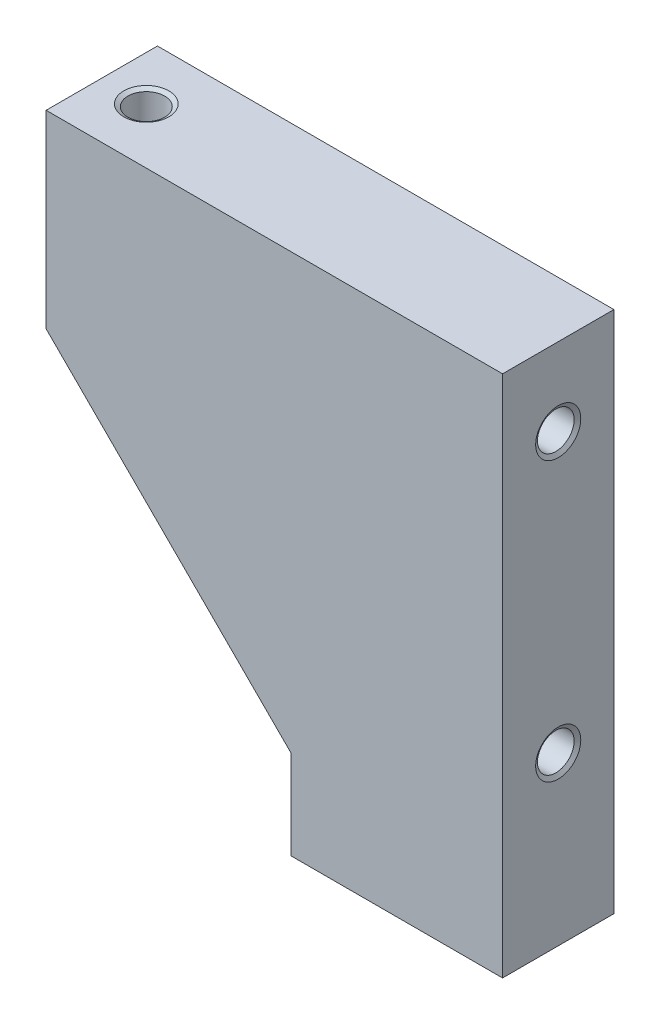
ISO-10303-21;
HEADER;
FILE_DESCRIPTION(('STEP AP214'),'2;1');
FILE_NAME('part.step','',(''),(''),'','','');
FILE_SCHEMA(('AUTOMOTIVE_DESIGN { 1 0 10303 214 1 1 1 1 }'));
ENDSEC;
DATA;
#1=APPLICATION_CONTEXT('core data for automotive mechanical design processes');
#2=APPLICATION_PROTOCOL_DEFINITION('international standard','automotive_design',2000,#1);
#3=PRODUCT_CONTEXT('',#1,'mechanical');
#4=PRODUCT('Part','Part','',(#3));
#5=PRODUCT_RELATED_PRODUCT_CATEGORY('part','',(#4));
#6=PRODUCT_DEFINITION_FORMATION('','',#4);
#7=PRODUCT_DEFINITION_CONTEXT('part definition',#1,'design');
#8=PRODUCT_DEFINITION('design','',#6,#7);
#9=PRODUCT_DEFINITION_SHAPE('','',#8);
#10=(LENGTH_UNIT() NAMED_UNIT(*) SI_UNIT(.MILLI.,.METRE.));
#11=(NAMED_UNIT(*) PLANE_ANGLE_UNIT() SI_UNIT($,.RADIAN.));
#12=(NAMED_UNIT(*) SI_UNIT($,.STERADIAN.) SOLID_ANGLE_UNIT());
#13=UNCERTAINTY_MEASURE_WITH_UNIT(LENGTH_MEASURE(1.E-05),#10,'distance_accuracy_value','');
#14=(GEOMETRIC_REPRESENTATION_CONTEXT(3) GLOBAL_UNCERTAINTY_ASSIGNED_CONTEXT((#13)) GLOBAL_UNIT_ASSIGNED_CONTEXT((#10,
#11,#12)) REPRESENTATION_CONTEXT('',''));
#15=CARTESIAN_POINT('',(0.,0.,0.));
#16=DIRECTION('',(0.,0.,1.));
#17=DIRECTION('',(1.,0.,0.));
#18=AXIS2_PLACEMENT_3D('',#15,#16,#17);
#19=CARTESIAN_POINT('',(19.,0.,10.));
#20=DIRECTION('',(0.,1.,0.));
#21=DIRECTION('',(-1.,0.,0.));
#22=AXIS2_PLACEMENT_3D('',#19,#20,#21);
#23=PLANE('',#22);
#24=DIRECTION('',(1.,0.,0.));
#25=VECTOR('',#24,1.);
#26=CARTESIAN_POINT('',(19.,0.,0.));
#27=LINE('',#26,#25);
#28=CARTESIAN_POINT('',(0.,0.,0.));
#29=VERTEX_POINT('',#28);
#30=CARTESIAN_POINT('',(19.,0.,0.));
#31=VERTEX_POINT('',#30);
#32=EDGE_CURVE('E125',#29,#31,#27,.T.);
#33=ORIENTED_EDGE('',*,*,#32,.T.);
#34=DIRECTION('',(0.,0.,-1.));
#35=VECTOR('',#34,1.);
#36=CARTESIAN_POINT('',(19.,0.,10.));
#37=LINE('',#36,#35);
#38=CARTESIAN_POINT('',(19.,0.,10.));
#39=VERTEX_POINT('',#38);
#40=EDGE_CURVE('E11',#39,#31,#37,.T.);
#41=ORIENTED_EDGE('',*,*,#40,.F.);
#42=DIRECTION('',(1.,0.,0.));
#43=VECTOR('',#42,1.);
#44=CARTESIAN_POINT('',(19.,0.,10.));
#45=LINE('',#44,#43);
#46=CARTESIAN_POINT('',(0.,0.,10.));
#47=VERTEX_POINT('',#46);
#48=EDGE_CURVE('E136',#47,#39,#45,.T.);
#49=ORIENTED_EDGE('',*,*,#48,.F.);
#50=DIRECTION('',(0.,0.,-1.));
#51=VECTOR('',#50,1.);
#52=CARTESIAN_POINT('',(0.,0.,10.));
#53=LINE('',#52,#51);
#54=EDGE_CURVE('E121',#47,#29,#53,.T.);
#55=ORIENTED_EDGE('',*,*,#54,.T.);
#56=EDGE_LOOP('',(#33,#41,#49,#55));
#57=FACE_BOUND('',#56,.T.);
#58=ADVANCED_FACE('F38',(#57),#23,.F.);
#59=CARTESIAN_POINT('',(19.,47.,10.));
#60=DIRECTION('',(-1.,0.,0.));
#61=DIRECTION('',(0.,-1.,0.));
#62=AXIS2_PLACEMENT_3D('',#59,#60,#61);
#63=PLANE('',#62);
#64=CARTESIAN_POINT('',(19.,40.,5.));
#65=DIRECTION('',(1.,0.,0.));
#66=DIRECTION('',(0.,0.,-1.));
#67=AXIS2_PLACEMENT_3D('',#64,#65,#66);
#68=CIRCLE('',#67,2.025);
#69=CARTESIAN_POINT('',(19.,40.,2.975));
#70=VERTEX_POINT('',#69);
#71=EDGE_CURVE('E194',#70,#70,#68,.T.);
#72=ORIENTED_EDGE('',*,*,#71,.F.);
#73=EDGE_LOOP('',(#72));
#74=FACE_BOUND('',#73,.T.);
#75=CARTESIAN_POINT('',(19.,15.,5.));
#76=DIRECTION('',(1.,0.,0.));
#77=DIRECTION('',(0.,0.,-1.));
#78=AXIS2_PLACEMENT_3D('',#75,#76,#77);
#79=CIRCLE('',#78,2.025);
#80=CARTESIAN_POINT('',(19.,15.,2.975));
#81=VERTEX_POINT('',#80);
#82=EDGE_CURVE('E203',#81,#81,#79,.T.);
#83=ORIENTED_EDGE('',*,*,#82,.F.);
#84=EDGE_LOOP('',(#83));
#85=FACE_BOUND('',#84,.T.);
#86=DIRECTION('',(0.,1.,0.));
#87=VECTOR('',#86,1.);
#88=CARTESIAN_POINT('',(19.,47.,0.));
#89=LINE('',#88,#87);
#90=CARTESIAN_POINT('',(19.,47.,0.));
#91=VERTEX_POINT('',#90);
#92=EDGE_CURVE('E128',#31,#91,#89,.T.);
#93=ORIENTED_EDGE('',*,*,#92,.T.);
#94=DIRECTION('',(0.,0.,-1.));
#95=VECTOR('',#94,1.);
#96=CARTESIAN_POINT('',(19.,47.,10.));
#97=LINE('',#96,#95);
#98=CARTESIAN_POINT('',(19.,47.,10.));
#99=VERTEX_POINT('',#98);
#100=EDGE_CURVE('E46',#99,#91,#97,.T.);
#101=ORIENTED_EDGE('',*,*,#100,.F.);
#102=DIRECTION('',(0.,1.,0.));
#103=VECTOR('',#102,1.);
#104=CARTESIAN_POINT('',(19.,47.,10.));
#105=LINE('',#104,#103);
#106=EDGE_CURVE('E92',#39,#99,#105,.T.);
#107=ORIENTED_EDGE('',*,*,#106,.F.);
#108=ORIENTED_EDGE('',*,*,#40,.T.);
#109=EDGE_LOOP('',(#93,#101,#107,#108));
#110=FACE_BOUND('',#109,.T.);
#111=ADVANCED_FACE('F160',(#74,#85,#110),#63,.F.);
#112=CARTESIAN_POINT('',(-22.,47.,10.));
#113=DIRECTION('',(0.,-1.,0.));
#114=DIRECTION('',(0.,0.,-1.));
#115=AXIS2_PLACEMENT_3D('',#112,#113,#114);
#116=PLANE('',#115);
#117=CARTESIAN_POINT('',(-18.,47.,5.));
#118=DIRECTION('',(0.,1.,0.));
#119=DIRECTION('',(0.,0.,1.));
#120=AXIS2_PLACEMENT_3D('',#117,#118,#119);
#121=CIRCLE('',#120,2.025);
#122=CARTESIAN_POINT('',(-18.,47.,7.025));
#123=VERTEX_POINT('',#122);
#124=EDGE_CURVE('E415',#123,#123,#121,.T.);
#125=ORIENTED_EDGE('',*,*,#124,.F.);
#126=EDGE_LOOP('',(#125));
#127=FACE_BOUND('',#126,.T.);
#128=DIRECTION('',(-1.,0.,0.));
#129=VECTOR('',#128,1.);
#130=CARTESIAN_POINT('',(-22.,47.,0.));
#131=LINE('',#130,#129);
#132=CARTESIAN_POINT('',(-22.,47.,0.));
#133=VERTEX_POINT('',#132);
#134=EDGE_CURVE('E131',#91,#133,#131,.T.);
#135=ORIENTED_EDGE('',*,*,#134,.T.);
#136=DIRECTION('',(0.,0.,-1.));
#137=VECTOR('',#136,1.);
#138=CARTESIAN_POINT('',(-22.,47.,10.));
#139=LINE('',#138,#137);
#140=CARTESIAN_POINT('',(-22.,47.,10.));
#141=VERTEX_POINT('',#140);
#142=EDGE_CURVE('E116',#141,#133,#139,.T.);
#143=ORIENTED_EDGE('',*,*,#142,.F.);
#144=DIRECTION('',(-1.,0.,0.));
#145=VECTOR('',#144,1.);
#146=CARTESIAN_POINT('',(-22.,47.,10.));
#147=LINE('',#146,#145);
#148=EDGE_CURVE('E107',#99,#141,#147,.T.);
#149=ORIENTED_EDGE('',*,*,#148,.F.);
#150=ORIENTED_EDGE('',*,*,#100,.T.);
#151=EDGE_LOOP('',(#135,#143,#149,#150));
#152=FACE_BOUND('',#151,.T.);
#153=ADVANCED_FACE('F142',(#127,#152),#116,.F.);
#154=CARTESIAN_POINT('',(-22.,29.9999999999999,10.));
#155=DIRECTION('',(1.,0.,0.));
#156=DIRECTION('',(0.,0.,-1.));
#157=AXIS2_PLACEMENT_3D('',#154,#155,#156);
#158=PLANE('',#157);
#159=CARTESIAN_POINT('',(-22.0000000000001,37.,5.));
#160=DIRECTION('',(-1.,0.,0.));
#161=DIRECTION('',(0.,0.,1.));
#162=AXIS2_PLACEMENT_3D('',#159,#160,#161);
#163=CIRCLE('',#162,2.02499999999994);
#164=CARTESIAN_POINT('',(-22.0000000000001,37.,7.02499999999994));
#165=VERTEX_POINT('',#164);
#166=EDGE_CURVE('E179',#165,#165,#163,.T.);
#167=ORIENTED_EDGE('',*,*,#166,.F.);
#168=EDGE_LOOP('',(#167));
#169=FACE_BOUND('',#168,.T.);
#170=DIRECTION('',(0.,-1.,0.));
#171=VECTOR('',#170,1.);
#172=CARTESIAN_POINT('',(-22.,29.9999999999999,0.));
#173=LINE('',#172,#171);
#174=CARTESIAN_POINT('',(-22.,29.9999999999999,0.));
#175=VERTEX_POINT('',#174);
#176=EDGE_CURVE('E115',#133,#175,#173,.T.);
#177=ORIENTED_EDGE('',*,*,#176,.T.);
#178=DIRECTION('',(0.,0.,-1.));
#179=VECTOR('',#178,1.);
#180=CARTESIAN_POINT('',(-22.,29.9999999999999,10.));
#181=LINE('',#180,#179);
#182=CARTESIAN_POINT('',(-22.,29.9999999999999,10.));
#183=VERTEX_POINT('',#182);
#184=EDGE_CURVE('E112',#183,#175,#181,.T.);
#185=ORIENTED_EDGE('',*,*,#184,.F.);
#186=DIRECTION('',(0.,-1.,0.));
#187=VECTOR('',#186,1.);
#188=CARTESIAN_POINT('',(-22.,29.9999999999999,10.));
#189=LINE('',#188,#187);
#190=EDGE_CURVE('E101',#141,#183,#189,.T.);
#191=ORIENTED_EDGE('',*,*,#190,.F.);
#192=ORIENTED_EDGE('',*,*,#142,.T.);
#193=EDGE_LOOP('',(#177,#185,#191,#192));
#194=FACE_BOUND('',#193,.T.);
#195=ADVANCED_FACE('F113',(#169,#194),#158,.F.);
#196=CARTESIAN_POINT('',(0.,8.,10.));
#197=DIRECTION('',(0.707106781186546,0.707106781186549,0.));
#198=DIRECTION('',(-0.707106781186549,0.707106781186546,0.));
#199=AXIS2_PLACEMENT_3D('',#196,#197,#198);
#200=PLANE('',#199);
#201=DIRECTION('',(0.707106781186549,-0.707106781186546,0.));
#202=VECTOR('',#201,1.);
#203=CARTESIAN_POINT('',(0.,8.,0.));
#204=LINE('',#203,#202);
#205=CARTESIAN_POINT('',(0.,8.,0.));
#206=VERTEX_POINT('',#205);
#207=EDGE_CURVE('E78',#175,#206,#204,.T.);
#208=ORIENTED_EDGE('',*,*,#207,.T.);
#209=DIRECTION('',(0.,0.,-1.));
#210=VECTOR('',#209,1.);
#211=CARTESIAN_POINT('',(0.,8.,10.));
#212=LINE('',#211,#210);
#213=CARTESIAN_POINT('',(0.,8.,10.));
#214=VERTEX_POINT('',#213);
#215=EDGE_CURVE('E117',#214,#206,#212,.T.);
#216=ORIENTED_EDGE('',*,*,#215,.F.);
#217=DIRECTION('',(0.707106781186549,-0.707106781186546,0.));
#218=VECTOR('',#217,1.);
#219=CARTESIAN_POINT('',(0.,8.,10.));
#220=LINE('',#219,#218);
#221=EDGE_CURVE('E105',#183,#214,#220,.T.);
#222=ORIENTED_EDGE('',*,*,#221,.F.);
#223=ORIENTED_EDGE('',*,*,#184,.T.);
#224=EDGE_LOOP('',(#208,#216,#222,#223));
#225=FACE_BOUND('',#224,.T.);
#226=ADVANCED_FACE('F119',(#225),#200,.F.);
#227=CARTESIAN_POINT('',(0.,0.,10.));
#228=DIRECTION('',(1.,0.,0.));
#229=DIRECTION('',(0.,0.,-1.));
#230=AXIS2_PLACEMENT_3D('',#227,#228,#229);
#231=PLANE('',#230);
#232=DIRECTION('',(0.,-1.,0.));
#233=VECTOR('',#232,1.);
#234=CARTESIAN_POINT('',(0.,0.,0.));
#235=LINE('',#234,#233);
#236=EDGE_CURVE('E84',#206,#29,#235,.T.);
#237=ORIENTED_EDGE('',*,*,#236,.T.);
#238=ORIENTED_EDGE('',*,*,#54,.F.);
#239=DIRECTION('',(0.,-1.,0.));
#240=VECTOR('',#239,1.);
#241=CARTESIAN_POINT('',(0.,0.,10.));
#242=LINE('',#241,#240);
#243=EDGE_CURVE('E54',#214,#47,#242,.T.);
#244=ORIENTED_EDGE('',*,*,#243,.F.);
#245=ORIENTED_EDGE('',*,*,#215,.T.);
#246=EDGE_LOOP('',(#237,#238,#244,#245));
#247=FACE_BOUND('',#246,.T.);
#248=ADVANCED_FACE('F149',(#247),#231,.F.);
#249=CARTESIAN_POINT('',(0.,0.,10.));
#250=DIRECTION('',(0.,0.,-1.));
#251=DIRECTION('',(-1.,0.,0.));
#252=AXIS2_PLACEMENT_3D('',#249,#250,#251);
#253=PLANE('',#252);
#254=ORIENTED_EDGE('',*,*,#48,.T.);
#255=ORIENTED_EDGE('',*,*,#106,.T.);
#256=ORIENTED_EDGE('',*,*,#148,.T.);
#257=ORIENTED_EDGE('',*,*,#190,.T.);
#258=ORIENTED_EDGE('',*,*,#221,.T.);
#259=ORIENTED_EDGE('',*,*,#243,.T.);
#260=EDGE_LOOP('',(#254,#255,#256,#257,#258,#259));
#261=FACE_BOUND('',#260,.T.);
#262=ADVANCED_FACE('F103',(#261),#253,.F.);
#263=CARTESIAN_POINT('',(0.,0.,0.));
#264=DIRECTION('',(0.,0.,-1.));
#265=DIRECTION('',(-1.,0.,0.));
#266=AXIS2_PLACEMENT_3D('',#263,#264,#265);
#267=PLANE('',#266);
#268=ORIENTED_EDGE('',*,*,#32,.F.);
#269=ORIENTED_EDGE('',*,*,#236,.F.);
#270=ORIENTED_EDGE('',*,*,#207,.F.);
#271=ORIENTED_EDGE('',*,*,#176,.F.);
#272=ORIENTED_EDGE('',*,*,#134,.F.);
#273=ORIENTED_EDGE('',*,*,#92,.F.);
#274=EDGE_LOOP('',(#268,#269,#270,#271,#272,#273));
#275=FACE_BOUND('',#274,.T.);
#276=ADVANCED_FACE('F145',(#275),#267,.T.);
#277=CARTESIAN_POINT('',(7.5,15.,5.));
#278=DIRECTION('',(1.,0.,0.));
#279=DIRECTION('',(0.,0.,-1.));
#280=AXIS2_PLACEMENT_3D('',#277,#278,#279);
#281=CONICAL_SURFACE('',#280,1.65,1.02974425867665);
#282=CARTESIAN_POINT('',(6.50857997860452,15.,5.));
#283=VERTEX_POINT('',#282);
#284=VERTEX_LOOP('',#283);
#285=FACE_BOUND('',#284,.T.);
#286=CARTESIAN_POINT('',(7.5,15.,5.));
#287=DIRECTION('',(1.,0.,0.));
#288=DIRECTION('',(0.,0.,-1.));
#289=AXIS2_PLACEMENT_3D('',#286,#287,#288);
#290=CIRCLE('',#289,1.65);
#291=CARTESIAN_POINT('',(7.5,15.,3.35));
#292=VERTEX_POINT('',#291);
#293=EDGE_CURVE('E129',#292,#292,#290,.T.);
#294=ORIENTED_EDGE('',*,*,#293,.T.);
#295=EDGE_LOOP('',(#294));
#296=FACE_BOUND('',#295,.T.);
#297=ADVANCED_FACE('F214',(#285,#296),#281,.F.);
#298=CARTESIAN_POINT('',(19.,15.,5.));
#299=DIRECTION('',(1.,0.,0.));
#300=DIRECTION('',(0.,0.,-1.));
#301=AXIS2_PLACEMENT_3D('',#298,#299,#300);
#302=CYLINDRICAL_SURFACE('',#301,1.65);
#303=ORIENTED_EDGE('',*,*,#293,.F.);
#304=EDGE_LOOP('',(#303));
#305=FACE_BOUND('',#304,.T.);
#306=CARTESIAN_POINT('',(18.7834936490539,15.,5.));
#307=DIRECTION('',(1.,0.,0.));
#308=DIRECTION('',(0.,0.,-1.));
#309=AXIS2_PLACEMENT_3D('',#306,#307,#308);
#310=CIRCLE('',#309,1.65);
#311=CARTESIAN_POINT('',(18.7834936490539,15.,3.35));
#312=VERTEX_POINT('',#311);
#313=EDGE_CURVE('E206',#312,#312,#310,.T.);
#314=ORIENTED_EDGE('',*,*,#313,.T.);
#315=EDGE_LOOP('',(#314));
#316=FACE_BOUND('',#315,.T.);
#317=ADVANCED_FACE('F216',(#305,#316),#302,.F.);
#318=CARTESIAN_POINT('',(19.,15.,5.));
#319=DIRECTION('',(1.,0.,0.));
#320=DIRECTION('',(0.,0.,-1.));
#321=AXIS2_PLACEMENT_3D('',#318,#319,#320);
#322=CONICAL_SURFACE('',#321,2.025,1.0471975511966);
#323=ORIENTED_EDGE('',*,*,#313,.F.);
#324=EDGE_LOOP('',(#323));
#325=FACE_BOUND('',#324,.T.);
#326=ORIENTED_EDGE('',*,*,#82,.T.);
#327=EDGE_LOOP('',(#326));
#328=FACE_BOUND('',#327,.T.);
#329=ADVANCED_FACE('F219',(#325,#328),#322,.F.);
#330=CARTESIAN_POINT('',(7.49999999999999,40.,5.));
#331=DIRECTION('',(1.,0.,0.));
#332=DIRECTION('',(0.,0.,-1.));
#333=AXIS2_PLACEMENT_3D('',#330,#331,#332);
#334=CONICAL_SURFACE('',#333,1.65,1.02974425867665);
#335=CARTESIAN_POINT('',(6.50857997860452,40.,5.));
#336=VERTEX_POINT('',#335);
#337=VERTEX_LOOP('',#336);
#338=FACE_BOUND('',#337,.T.);
#339=CARTESIAN_POINT('',(7.49999999999999,40.,5.));
#340=DIRECTION('',(1.,0.,0.));
#341=DIRECTION('',(0.,0.,-1.));
#342=AXIS2_PLACEMENT_3D('',#339,#340,#341);
#343=CIRCLE('',#342,1.65);
#344=CARTESIAN_POINT('',(7.49999999999999,40.,3.35));
#345=VERTEX_POINT('',#344);
#346=EDGE_CURVE('E200',#345,#345,#343,.T.);
#347=ORIENTED_EDGE('',*,*,#346,.T.);
#348=EDGE_LOOP('',(#347));
#349=FACE_BOUND('',#348,.T.);
#350=ADVANCED_FACE('F225',(#338,#349),#334,.F.);
#351=CARTESIAN_POINT('',(19.,40.,5.));
#352=DIRECTION('',(1.,0.,0.));
#353=DIRECTION('',(0.,0.,-1.));
#354=AXIS2_PLACEMENT_3D('',#351,#352,#353);
#355=CYLINDRICAL_SURFACE('',#354,1.65);
#356=ORIENTED_EDGE('',*,*,#346,.F.);
#357=EDGE_LOOP('',(#356));
#358=FACE_BOUND('',#357,.T.);
#359=CARTESIAN_POINT('',(18.7834936490539,40.,5.));
#360=DIRECTION('',(1.,0.,0.));
#361=DIRECTION('',(0.,0.,-1.));
#362=AXIS2_PLACEMENT_3D('',#359,#360,#361);
#363=CIRCLE('',#362,1.65);
#364=CARTESIAN_POINT('',(18.7834936490539,40.,3.35));
#365=VERTEX_POINT('',#364);
#366=EDGE_CURVE('E197',#365,#365,#363,.T.);
#367=ORIENTED_EDGE('',*,*,#366,.T.);
#368=EDGE_LOOP('',(#367));
#369=FACE_BOUND('',#368,.T.);
#370=ADVANCED_FACE('F231',(#358,#369),#355,.F.);
#371=CARTESIAN_POINT('',(19.,40.,5.));
#372=DIRECTION('',(1.,0.,0.));
#373=DIRECTION('',(0.,0.,-1.));
#374=AXIS2_PLACEMENT_3D('',#371,#372,#373);
#375=CONICAL_SURFACE('',#374,2.025,1.0471975511966);
#376=ORIENTED_EDGE('',*,*,#366,.F.);
#377=EDGE_LOOP('',(#376));
#378=FACE_BOUND('',#377,.T.);
#379=ORIENTED_EDGE('',*,*,#71,.T.);
#380=EDGE_LOOP('',(#379));
#381=FACE_BOUND('',#380,.T.);
#382=ADVANCED_FACE('F261',(#378,#381),#375,.F.);
#383=CARTESIAN_POINT('',(-10.5,37.,5.));
#384=DIRECTION('',(-1.,0.,0.));
#385=DIRECTION('',(0.,0.,1.));
#386=AXIS2_PLACEMENT_3D('',#383,#384,#385);
#387=CONICAL_SURFACE('',#386,1.65,1.02974425867665);
#388=CARTESIAN_POINT('',(-9.50857997860453,37.,5.));
#389=VERTEX_POINT('',#388);
#390=VERTEX_LOOP('',#389);
#391=FACE_BOUND('',#390,.T.);
#392=CARTESIAN_POINT('',(-10.5,37.,5.));
#393=DIRECTION('',(-1.,0.,0.));
#394=DIRECTION('',(0.,0.,1.));
#395=AXIS2_PLACEMENT_3D('',#392,#393,#394);
#396=CIRCLE('',#395,1.65);
#397=CARTESIAN_POINT('',(-10.5,37.,6.65));
#398=VERTEX_POINT('',#397);
#399=EDGE_CURVE('E185',#398,#398,#396,.T.);
#400=ORIENTED_EDGE('',*,*,#399,.T.);
#401=EDGE_LOOP('',(#400));
#402=FACE_BOUND('',#401,.T.);
#403=ADVANCED_FACE('F272',(#391,#402),#387,.F.);
#404=CARTESIAN_POINT('',(-22.,37.,5.));
#405=DIRECTION('',(-1.,0.,0.));
#406=DIRECTION('',(0.,0.,1.));
#407=AXIS2_PLACEMENT_3D('',#404,#405,#406);
#408=CYLINDRICAL_SURFACE('',#407,1.65);
#409=ORIENTED_EDGE('',*,*,#399,.F.);
#410=EDGE_LOOP('',(#409));
#411=FACE_BOUND('',#410,.T.);
#412=CARTESIAN_POINT('',(-21.7834936490541,37.,5.));
#413=DIRECTION('',(-1.,0.,0.));
#414=DIRECTION('',(0.,0.,1.));
#415=AXIS2_PLACEMENT_3D('',#412,#413,#414);
#416=CIRCLE('',#415,1.65);
#417=CARTESIAN_POINT('',(-21.7834936490541,37.,6.65));
#418=VERTEX_POINT('',#417);
#419=EDGE_CURVE('E181',#418,#418,#416,.T.);
#420=ORIENTED_EDGE('',*,*,#419,.T.);
#421=EDGE_LOOP('',(#420));
#422=FACE_BOUND('',#421,.T.);
#423=ADVANCED_FACE('F267',(#411,#422),#408,.F.);
#424=CARTESIAN_POINT('',(-22.0000000000001,37.,5.));
#425=DIRECTION('',(-1.,0.,0.));
#426=DIRECTION('',(0.,0.,1.));
#427=AXIS2_PLACEMENT_3D('',#424,#425,#426);
#428=CONICAL_SURFACE('',#427,2.02499999999994,1.04719755119662);
#429=ORIENTED_EDGE('',*,*,#419,.F.);
#430=EDGE_LOOP('',(#429));
#431=FACE_BOUND('',#430,.T.);
#432=ORIENTED_EDGE('',*,*,#166,.T.);
#433=EDGE_LOOP('',(#432));
#434=FACE_BOUND('',#433,.T.);
#435=ADVANCED_FACE('F271',(#431,#434),#428,.F.);
#436=CARTESIAN_POINT('',(-18.,41.,5.));
#437=DIRECTION('',(0.,1.,0.));
#438=DIRECTION('',(0.,0.,1.));
#439=AXIS2_PLACEMENT_3D('',#436,#437,#438);
#440=CONICAL_SURFACE('',#439,1.65,1.02974425867665);
#441=CARTESIAN_POINT('',(-18.,40.0085799786045,5.));
#442=VERTEX_POINT('',#441);
#443=VERTEX_LOOP('',#442);
#444=FACE_BOUND('',#443,.T.);
#445=CARTESIAN_POINT('',(-18.,41.,5.));
#446=DIRECTION('',(0.,1.,0.));
#447=DIRECTION('',(0.,0.,1.));
#448=AXIS2_PLACEMENT_3D('',#445,#446,#447);
#449=CIRCLE('',#448,1.65);
#450=CARTESIAN_POINT('',(-18.,41.,6.65));
#451=VERTEX_POINT('',#450);
#452=EDGE_CURVE('E182',#451,#451,#449,.T.);
#453=ORIENTED_EDGE('',*,*,#452,.T.);
#454=EDGE_LOOP('',(#453));
#455=FACE_BOUND('',#454,.T.);
#456=ADVANCED_FACE('F285',(#444,#455),#440,.F.);
#457=CARTESIAN_POINT('',(-18.,47.,5.));
#458=DIRECTION('',(0.,1.,0.));
#459=DIRECTION('',(0.,0.,1.));
#460=AXIS2_PLACEMENT_3D('',#457,#458,#459);
#461=CYLINDRICAL_SURFACE('',#460,1.65);
#462=ORIENTED_EDGE('',*,*,#452,.F.);
#463=EDGE_LOOP('',(#462));
#464=FACE_BOUND('',#463,.T.);
#465=CARTESIAN_POINT('',(-18.,46.7834936490539,5.));
#466=DIRECTION('',(0.,1.,0.));
#467=DIRECTION('',(0.,0.,1.));
#468=AXIS2_PLACEMENT_3D('',#465,#466,#467);
#469=CIRCLE('',#468,1.64999999999999);
#470=CARTESIAN_POINT('',(-18.,46.7834936490539,6.64999999999999));
#471=VERTEX_POINT('',#470);
#472=EDGE_CURVE('E188',#471,#471,#469,.T.);
#473=ORIENTED_EDGE('',*,*,#472,.T.);
#474=EDGE_LOOP('',(#473));
#475=FACE_BOUND('',#474,.T.);
#476=ADVANCED_FACE('F281',(#464,#475),#461,.F.);
#477=CARTESIAN_POINT('',(-18.,47.,5.));
#478=DIRECTION('',(0.,1.,0.));
#479=DIRECTION('',(0.,0.,1.));
#480=AXIS2_PLACEMENT_3D('',#477,#478,#479);
#481=CONICAL_SURFACE('',#480,2.025,1.0471975511966);
#482=ORIENTED_EDGE('',*,*,#472,.F.);
#483=EDGE_LOOP('',(#482));
#484=FACE_BOUND('',#483,.T.);
#485=ORIENTED_EDGE('',*,*,#124,.T.);
#486=EDGE_LOOP('',(#485));
#487=FACE_BOUND('',#486,.T.);
#488=ADVANCED_FACE('F284',(#484,#487),#481,.F.);
#489=CLOSED_SHELL('',(#58,#111,#153,#195,#226,#248,#262,#276,#297,#317,#329,#350,#370,#382,#403,
#423,#435,#456,#476,#488));
#490=MANIFOLD_SOLID_BREP('B2',#489);
#491=ADVANCED_BREP_SHAPE_REPRESENTATION('',(#18,#490),#14);
#492=SHAPE_DEFINITION_REPRESENTATION(#9,#491);
ENDSEC;
END-ISO-10303-21;
